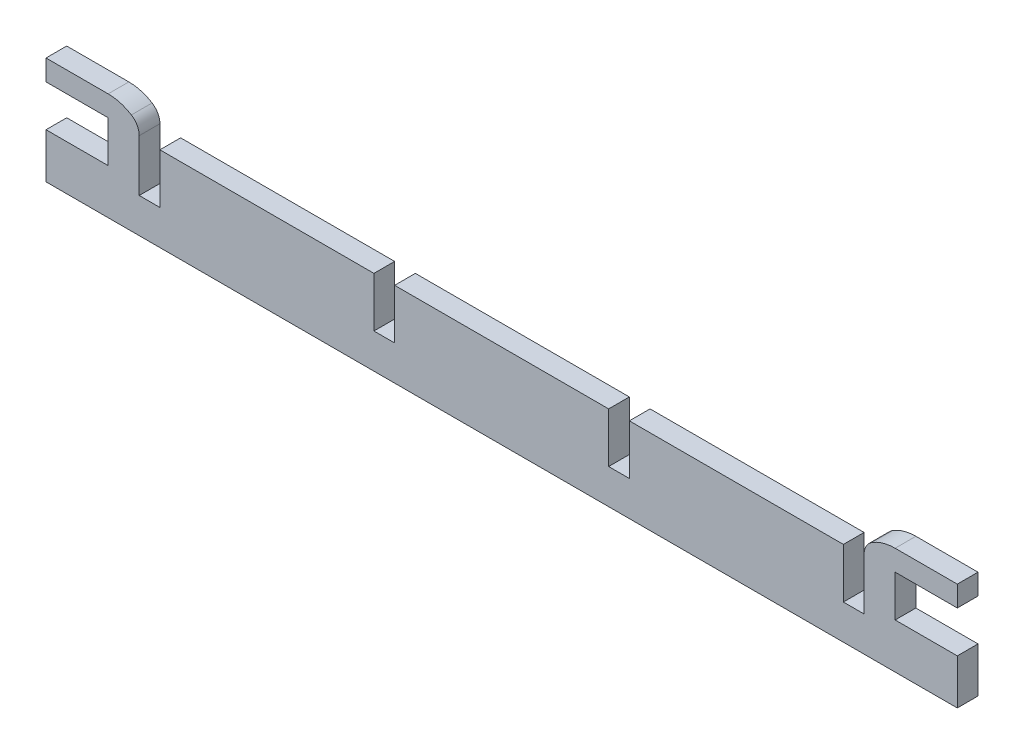
ISO-10303-21;
HEADER;
FILE_DESCRIPTION(('STEP AP214'),'2;1');
FILE_NAME('part.step','',(''),(''),'','','');
FILE_SCHEMA(('AUTOMOTIVE_DESIGN { 1 0 10303 214 1 1 1 1 }'));
ENDSEC;
DATA;
#1=APPLICATION_CONTEXT('core data for automotive mechanical design processes');
#2=APPLICATION_PROTOCOL_DEFINITION('international standard','automotive_design',2000,#1);
#3=PRODUCT_CONTEXT('',#1,'mechanical');
#4=PRODUCT('Part','Part','',(#3));
#5=PRODUCT_RELATED_PRODUCT_CATEGORY('part','',(#4));
#6=PRODUCT_DEFINITION_FORMATION('','',#4);
#7=PRODUCT_DEFINITION_CONTEXT('part definition',#1,'design');
#8=PRODUCT_DEFINITION('design','',#6,#7);
#9=PRODUCT_DEFINITION_SHAPE('','',#8);
#10=(LENGTH_UNIT() NAMED_UNIT(*) SI_UNIT(.MILLI.,.METRE.));
#11=(NAMED_UNIT(*) PLANE_ANGLE_UNIT() SI_UNIT($,.RADIAN.));
#12=(NAMED_UNIT(*) SI_UNIT($,.STERADIAN.) SOLID_ANGLE_UNIT());
#13=UNCERTAINTY_MEASURE_WITH_UNIT(LENGTH_MEASURE(1.E-05),#10,'distance_accuracy_value','');
#14=(GEOMETRIC_REPRESENTATION_CONTEXT(3) GLOBAL_UNCERTAINTY_ASSIGNED_CONTEXT((#13)) GLOBAL_UNIT_ASSIGNED_CONTEXT((#10,
#11,#12)) REPRESENTATION_CONTEXT('',''));
#15=CARTESIAN_POINT('',(0.,0.,0.));
#16=DIRECTION('',(0.,0.,1.));
#17=DIRECTION('',(1.,0.,0.));
#18=AXIS2_PLACEMENT_3D('',#15,#16,#17);
#19=CARTESIAN_POINT('',(34.925,12.1310866467926,6.35));
#20=DIRECTION('',(0.,-1.,0.));
#21=DIRECTION('',(1.,0.,0.));
#22=AXIS2_PLACEMENT_3D('',#19,#20,#21);
#23=PLANE('',#22);
#24=DIRECTION('',(-1.,0.,0.));
#25=VECTOR('',#24,1.);
#26=CARTESIAN_POINT('',(34.925,12.1310866467926,6.35));
#27=LINE('',#26,#25);
#28=CARTESIAN_POINT('',(100.541666666667,12.1310866467926,6.35));
#29=VERTEX_POINT('',#28);
#30=CARTESIAN_POINT('',(34.925,12.1310866467926,6.35));
#31=VERTEX_POINT('',#30);
#32=EDGE_CURVE('E463',#29,#31,#27,.T.);
#33=ORIENTED_EDGE('',*,*,#32,.F.);
#34=DIRECTION('',(0.,0.,1.));
#35=VECTOR('',#34,1.);
#36=CARTESIAN_POINT('',(100.541666666667,12.1310866467926,0.));
#37=LINE('',#36,#35);
#38=CARTESIAN_POINT('',(100.541666666667,12.1310866467926,0.));
#39=VERTEX_POINT('',#38);
#40=EDGE_CURVE('E286',#39,#29,#37,.T.);
#41=ORIENTED_EDGE('',*,*,#40,.F.);
#42=DIRECTION('',(-1.,0.,0.));
#43=VECTOR('',#42,1.);
#44=CARTESIAN_POINT('',(34.925,12.1310866467926,0.));
#45=LINE('',#44,#43);
#46=CARTESIAN_POINT('',(34.925,12.1310866467926,0.));
#47=VERTEX_POINT('',#46);
#48=EDGE_CURVE('E271',#39,#47,#45,.T.);
#49=ORIENTED_EDGE('',*,*,#48,.T.);
#50=DIRECTION('',(0.,0.,-1.));
#51=VECTOR('',#50,1.);
#52=CARTESIAN_POINT('',(34.925,12.1310866467926,6.35));
#53=LINE('',#52,#51);
#54=EDGE_CURVE('E48',#31,#47,#53,.T.);
#55=ORIENTED_EDGE('',*,*,#54,.F.);
#56=EDGE_LOOP('',(#33,#41,#49,#55));
#57=FACE_BOUND('',#56,.T.);
#58=ADVANCED_FACE('F39',(#57),#23,.F.);
#59=CARTESIAN_POINT('',(172.508333333333,12.1310866467926,0.));
#60=VERTEX_POINT('',#59);
#61=CARTESIAN_POINT('',(106.891666666667,12.1310866467926,0.));
#62=VERTEX_POINT('',#61);
#63=EDGE_CURVE('E511',#60,#62,#45,.T.);
#64=ORIENTED_EDGE('',*,*,#63,.T.);
#65=DIRECTION('',(0.,0.,1.));
#66=VECTOR('',#65,1.);
#67=CARTESIAN_POINT('',(106.891666666667,12.1310866467926,0.));
#68=LINE('',#67,#66);
#69=CARTESIAN_POINT('',(106.891666666667,12.1310866467926,6.35));
#70=VERTEX_POINT('',#69);
#71=EDGE_CURVE('E290',#62,#70,#68,.T.);
#72=ORIENTED_EDGE('',*,*,#71,.T.);
#73=CARTESIAN_POINT('',(172.508333333333,12.1310866467926,6.35));
#74=VERTEX_POINT('',#73);
#75=EDGE_CURVE('E469',#74,#70,#27,.T.);
#76=ORIENTED_EDGE('',*,*,#75,.F.);
#77=DIRECTION('',(0.,0.,1.));
#78=VECTOR('',#77,1.);
#79=CARTESIAN_POINT('',(172.508333333333,12.1310866467926,0.));
#80=LINE('',#79,#78);
#81=EDGE_CURVE('E283',#60,#74,#80,.T.);
#82=ORIENTED_EDGE('',*,*,#81,.F.);
#83=EDGE_LOOP('',(#64,#72,#76,#82));
#84=FACE_BOUND('',#83,.T.);
#85=ADVANCED_FACE('F612',(#84),#23,.F.);
#86=CARTESIAN_POINT('',(0.,0.,6.35));
#87=DIRECTION('',(1.,0.,0.));
#88=DIRECTION('',(0.,1.,0.));
#89=AXIS2_PLACEMENT_3D('',#86,#87,#88);
#90=PLANE('',#89);
#91=DIRECTION('',(0.,-1.,0.));
#92=VECTOR('',#91,1.);
#93=CARTESIAN_POINT('',(0.,0.,0.));
#94=LINE('',#93,#92);
#95=CARTESIAN_POINT('',(0.,0.,0.));
#96=VERTEX_POINT('',#95);
#97=CARTESIAN_POINT('',(0.,-13.843,0.));
#98=VERTEX_POINT('',#97);
#99=EDGE_CURVE('E454',#96,#98,#94,.T.);
#100=ORIENTED_EDGE('',*,*,#99,.T.);
#101=DIRECTION('',(0.,0.,-1.));
#102=VECTOR('',#101,1.);
#103=CARTESIAN_POINT('',(0.,-13.843,6.35));
#104=LINE('',#103,#102);
#105=CARTESIAN_POINT('',(0.,-13.843,6.35));
#106=VERTEX_POINT('',#105);
#107=EDGE_CURVE('E11',#106,#98,#104,.T.);
#108=ORIENTED_EDGE('',*,*,#107,.F.);
#109=DIRECTION('',(0.,-1.,0.));
#110=VECTOR('',#109,1.);
#111=CARTESIAN_POINT('',(0.,0.,6.35));
#112=LINE('',#111,#110);
#113=CARTESIAN_POINT('',(0.,0.,6.35));
#114=VERTEX_POINT('',#113);
#115=EDGE_CURVE('E455',#114,#106,#112,.T.);
#116=ORIENTED_EDGE('',*,*,#115,.F.);
#117=DIRECTION('',(0.,0.,-1.));
#118=VECTOR('',#117,1.);
#119=CARTESIAN_POINT('',(0.,0.,6.35));
#120=LINE('',#119,#118);
#121=EDGE_CURVE('E499',#114,#96,#120,.T.);
#122=ORIENTED_EDGE('',*,*,#121,.T.);
#123=EDGE_LOOP('',(#100,#108,#116,#122));
#124=FACE_BOUND('',#123,.T.);
#125=ADVANCED_FACE('F41',(#124),#90,.F.);
#126=CARTESIAN_POINT('',(0.,-13.843,6.35));
#127=DIRECTION('',(0.,1.,0.));
#128=DIRECTION('',(0.,0.,1.));
#129=AXIS2_PLACEMENT_3D('',#126,#127,#128);
#130=PLANE('',#129);
#131=DIRECTION('',(1.,0.,0.));
#132=VECTOR('',#131,1.);
#133=CARTESIAN_POINT('',(0.,-13.843,0.));
#134=LINE('',#133,#132);
#135=CARTESIAN_POINT('',(279.4,-13.843,0.));
#136=VERTEX_POINT('',#135);
#137=EDGE_CURVE('E503',#98,#136,#134,.T.);
#138=ORIENTED_EDGE('',*,*,#137,.T.);
#139=DIRECTION('',(0.,0.,-1.));
#140=VECTOR('',#139,1.);
#141=CARTESIAN_POINT('',(279.4,-13.843,6.35));
#142=LINE('',#141,#140);
#143=CARTESIAN_POINT('',(279.4,-13.843,6.35));
#144=VERTEX_POINT('',#143);
#145=EDGE_CURVE('E374',#144,#136,#142,.T.);
#146=ORIENTED_EDGE('',*,*,#145,.F.);
#147=DIRECTION('',(1.,0.,0.));
#148=VECTOR('',#147,1.);
#149=CARTESIAN_POINT('',(0.,-13.843,6.35));
#150=LINE('',#149,#148);
#151=EDGE_CURVE('E459',#106,#144,#150,.T.);
#152=ORIENTED_EDGE('',*,*,#151,.F.);
#153=ORIENTED_EDGE('',*,*,#107,.T.);
#154=EDGE_LOOP('',(#138,#146,#152,#153));
#155=FACE_BOUND('',#154,.T.);
#156=ADVANCED_FACE('F625',(#155),#130,.F.);
#157=CARTESIAN_POINT('',(244.475,12.1310866467926,0.));
#158=VERTEX_POINT('',#157);
#159=CARTESIAN_POINT('',(178.858333333333,12.1310866467926,0.));
#160=VERTEX_POINT('',#159);
#161=EDGE_CURVE('E506',#158,#160,#45,.T.);
#162=ORIENTED_EDGE('',*,*,#161,.T.);
#163=DIRECTION('',(0.,0.,1.));
#164=VECTOR('',#163,1.);
#165=CARTESIAN_POINT('',(178.858333333333,12.1310866467926,0.));
#166=LINE('',#165,#164);
#167=CARTESIAN_POINT('',(178.858333333333,12.1310866467926,6.35));
#168=VERTEX_POINT('',#167);
#169=EDGE_CURVE('E320',#160,#168,#166,.T.);
#170=ORIENTED_EDGE('',*,*,#169,.T.);
#171=CARTESIAN_POINT('',(244.475,12.1310866467926,6.35));
#172=VERTEX_POINT('',#171);
#173=EDGE_CURVE('E464',#172,#168,#27,.T.);
#174=ORIENTED_EDGE('',*,*,#173,.F.);
#175=DIRECTION('',(0.,0.,-1.));
#176=VECTOR('',#175,1.);
#177=CARTESIAN_POINT('',(244.475,12.1310866467926,6.35));
#178=LINE('',#177,#176);
#179=EDGE_CURVE('E419',#172,#158,#178,.T.);
#180=ORIENTED_EDGE('',*,*,#179,.T.);
#181=EDGE_LOOP('',(#162,#170,#174,#180));
#182=FACE_BOUND('',#181,.T.);
#183=ADVANCED_FACE('F619',(#182),#23,.F.);
#184=CARTESIAN_POINT('',(34.925,-3.175,6.35));
#185=DIRECTION('',(1.,0.,0.));
#186=DIRECTION('',(0.,0.,-1.));
#187=AXIS2_PLACEMENT_3D('',#184,#185,#186);
#188=PLANE('',#187);
#189=DIRECTION('',(0.,-1.,0.));
#190=VECTOR('',#189,1.);
#191=CARTESIAN_POINT('',(34.925,-3.175,0.));
#192=LINE('',#191,#190);
#193=CARTESIAN_POINT('',(34.925,-3.175,0.));
#194=VERTEX_POINT('',#193);
#195=EDGE_CURVE('E510',#47,#194,#192,.T.);
#196=ORIENTED_EDGE('',*,*,#195,.T.);
#197=DIRECTION('',(0.,0.,-1.));
#198=VECTOR('',#197,1.);
#199=CARTESIAN_POINT('',(34.925,-3.175,6.35));
#200=LINE('',#199,#198);
#201=CARTESIAN_POINT('',(34.925,-3.175,6.35));
#202=VERTEX_POINT('',#201);
#203=EDGE_CURVE('E576',#202,#194,#200,.T.);
#204=ORIENTED_EDGE('',*,*,#203,.F.);
#205=DIRECTION('',(0.,-1.,0.));
#206=VECTOR('',#205,1.);
#207=CARTESIAN_POINT('',(34.925,-3.175,6.35));
#208=LINE('',#207,#206);
#209=EDGE_CURVE('E468',#31,#202,#208,.T.);
#210=ORIENTED_EDGE('',*,*,#209,.F.);
#211=ORIENTED_EDGE('',*,*,#54,.T.);
#212=EDGE_LOOP('',(#196,#204,#210,#211));
#213=FACE_BOUND('',#212,.T.);
#214=ADVANCED_FACE('F584',(#213),#188,.F.);
#215=CARTESIAN_POINT('',(28.575,-3.175,6.35));
#216=DIRECTION('',(0.,-1.,0.));
#217=DIRECTION('',(1.,0.,0.));
#218=AXIS2_PLACEMENT_3D('',#215,#216,#217);
#219=PLANE('',#218);
#220=DIRECTION('',(-1.,0.,0.));
#221=VECTOR('',#220,1.);
#222=CARTESIAN_POINT('',(28.575,-3.175,0.));
#223=LINE('',#222,#221);
#224=CARTESIAN_POINT('',(28.575,-3.175,0.));
#225=VERTEX_POINT('',#224);
#226=EDGE_CURVE('E514',#194,#225,#223,.T.);
#227=ORIENTED_EDGE('',*,*,#226,.T.);
#228=DIRECTION('',(0.,0.,-1.));
#229=VECTOR('',#228,1.);
#230=CARTESIAN_POINT('',(28.575,-3.175,6.35));
#231=LINE('',#230,#229);
#232=CARTESIAN_POINT('',(28.575,-3.175,6.35));
#233=VERTEX_POINT('',#232);
#234=EDGE_CURVE('E572',#233,#225,#231,.T.);
#235=ORIENTED_EDGE('',*,*,#234,.F.);
#236=DIRECTION('',(-1.,0.,0.));
#237=VECTOR('',#236,1.);
#238=CARTESIAN_POINT('',(28.575,-3.175,6.35));
#239=LINE('',#238,#237);
#240=EDGE_CURVE('E472',#202,#233,#239,.T.);
#241=ORIENTED_EDGE('',*,*,#240,.F.);
#242=ORIENTED_EDGE('',*,*,#203,.T.);
#243=EDGE_LOOP('',(#227,#235,#241,#242));
#244=FACE_BOUND('',#243,.T.);
#245=ADVANCED_FACE('F592',(#244),#219,.F.);
#246=CARTESIAN_POINT('',(28.575,0.,6.35));
#247=DIRECTION('',(-1.,0.,0.));
#248=DIRECTION('',(0.,-1.,0.));
#249=AXIS2_PLACEMENT_3D('',#246,#247,#248);
#250=PLANE('',#249);
#251=DIRECTION('',(0.,1.,0.));
#252=VECTOR('',#251,1.);
#253=CARTESIAN_POINT('',(28.575,0.,0.));
#254=LINE('',#253,#252);
#255=CARTESIAN_POINT('',(28.575,12.7,0.));
#256=VERTEX_POINT('',#255);
#257=EDGE_CURVE('E518',#225,#256,#254,.T.);
#258=ORIENTED_EDGE('',*,*,#257,.T.);
#259=DIRECTION('',(0.,0.,-1.));
#260=VECTOR('',#259,1.);
#261=CARTESIAN_POINT('',(28.575,12.7,6.35));
#262=LINE('',#261,#260);
#263=CARTESIAN_POINT('',(28.575,12.7,6.35));
#264=VERTEX_POINT('',#263);
#265=EDGE_CURVE('E568',#264,#256,#262,.T.);
#266=ORIENTED_EDGE('',*,*,#265,.F.);
#267=DIRECTION('',(0.,1.,0.));
#268=VECTOR('',#267,1.);
#269=CARTESIAN_POINT('',(28.575,0.,6.35));
#270=LINE('',#269,#268);
#271=EDGE_CURVE('E475',#233,#264,#270,.T.);
#272=ORIENTED_EDGE('',*,*,#271,.F.);
#273=ORIENTED_EDGE('',*,*,#234,.T.);
#274=EDGE_LOOP('',(#258,#266,#272,#273));
#275=FACE_BOUND('',#274,.T.);
#276=ADVANCED_FACE('F596',(#275),#250,.F.);
#277=CARTESIAN_POINT('',(23.495,12.7,6.35));
#278=DIRECTION('',(0.,0.,-1.));
#279=DIRECTION('',(-1.,0.,0.));
#280=AXIS2_PLACEMENT_3D('',#277,#278,#279);
#281=CYLINDRICAL_SURFACE('',#280,5.08);
#282=CARTESIAN_POINT('',(23.495,12.7,0.));
#283=DIRECTION('',(0.,0.,1.));
#284=DIRECTION('',(-1.,0.,0.));
#285=AXIS2_PLACEMENT_3D('',#282,#283,#284);
#286=CIRCLE('',#285,5.08);
#287=CARTESIAN_POINT('',(26.1787735849057,17.0132075471698,0.));
#288=VERTEX_POINT('',#287);
#289=EDGE_CURVE('E521',#256,#288,#286,.T.);
#290=ORIENTED_EDGE('',*,*,#289,.T.);
#291=DIRECTION('',(0.,0.,-1.));
#292=VECTOR('',#291,1.);
#293=CARTESIAN_POINT('',(26.1787735849057,17.0132075471698,6.35));
#294=LINE('',#293,#292);
#295=CARTESIAN_POINT('',(26.1787735849057,17.0132075471698,6.35));
#296=VERTEX_POINT('',#295);
#297=EDGE_CURVE('E564',#296,#288,#294,.T.);
#298=ORIENTED_EDGE('',*,*,#297,.F.);
#299=CARTESIAN_POINT('',(23.495,12.7,6.35));
#300=DIRECTION('',(0.,0.,1.));
#301=DIRECTION('',(-1.,0.,0.));
#302=AXIS2_PLACEMENT_3D('',#299,#300,#301);
#303=CIRCLE('',#302,5.08);
#304=EDGE_CURVE('E478',#264,#296,#303,.T.);
#305=ORIENTED_EDGE('',*,*,#304,.F.);
#306=ORIENTED_EDGE('',*,*,#265,.T.);
#307=EDGE_LOOP('',(#290,#298,#305,#306));
#308=FACE_BOUND('',#307,.T.);
#309=ADVANCED_FACE('F718',(#308),#281,.T.);
#310=CARTESIAN_POINT('',(19.05,5.55624999999997,6.35));
#311=DIRECTION('',(0.,0.,-1.));
#312=DIRECTION('',(-1.,0.,0.));
#313=AXIS2_PLACEMENT_3D('',#310,#311,#312);
#314=CYLINDRICAL_SURFACE('',#313,13.49375);
#315=CARTESIAN_POINT('',(19.05,5.55624999999997,0.));
#316=DIRECTION('',(0.,0.,1.));
#317=DIRECTION('',(-1.,0.,0.));
#318=AXIS2_PLACEMENT_3D('',#315,#316,#317);
#319=CIRCLE('',#318,13.49375);
#320=CARTESIAN_POINT('',(19.05,19.05,0.));
#321=VERTEX_POINT('',#320);
#322=EDGE_CURVE('E524',#288,#321,#319,.T.);
#323=ORIENTED_EDGE('',*,*,#322,.T.);
#324=DIRECTION('',(0.,0.,-1.));
#325=VECTOR('',#324,1.);
#326=CARTESIAN_POINT('',(19.05,19.05,6.35));
#327=LINE('',#326,#325);
#328=CARTESIAN_POINT('',(19.05,19.05,6.35));
#329=VERTEX_POINT('',#328);
#330=EDGE_CURVE('E560',#329,#321,#327,.T.);
#331=ORIENTED_EDGE('',*,*,#330,.F.);
#332=CARTESIAN_POINT('',(19.05,5.55624999999997,6.35));
#333=DIRECTION('',(0.,0.,1.));
#334=DIRECTION('',(-1.,0.,0.));
#335=AXIS2_PLACEMENT_3D('',#332,#333,#334);
#336=CIRCLE('',#335,13.49375);
#337=EDGE_CURVE('E481',#296,#329,#336,.T.);
#338=ORIENTED_EDGE('',*,*,#337,.F.);
#339=ORIENTED_EDGE('',*,*,#297,.T.);
#340=EDGE_LOOP('',(#323,#331,#338,#339));
#341=FACE_BOUND('',#340,.T.);
#342=ADVANCED_FACE('F716',(#341),#314,.T.);
#343=CARTESIAN_POINT('',(0.,19.05,6.35));
#344=DIRECTION('',(0.,-1.,0.));
#345=DIRECTION('',(1.,0.,0.));
#346=AXIS2_PLACEMENT_3D('',#343,#344,#345);
#347=PLANE('',#346);
#348=DIRECTION('',(-1.,0.,0.));
#349=VECTOR('',#348,1.);
#350=CARTESIAN_POINT('',(0.,19.05,0.));
#351=LINE('',#350,#349);
#352=CARTESIAN_POINT('',(0.,19.05,0.));
#353=VERTEX_POINT('',#352);
#354=EDGE_CURVE('E527',#321,#353,#351,.T.);
#355=ORIENTED_EDGE('',*,*,#354,.T.);
#356=DIRECTION('',(0.,0.,-1.));
#357=VECTOR('',#356,1.);
#358=CARTESIAN_POINT('',(0.,19.05,6.35));
#359=LINE('',#358,#357);
#360=CARTESIAN_POINT('',(0.,19.05,6.35));
#361=VERTEX_POINT('',#360);
#362=EDGE_CURVE('E556',#361,#353,#359,.T.);
#363=ORIENTED_EDGE('',*,*,#362,.F.);
#364=DIRECTION('',(-1.,0.,0.));
#365=VECTOR('',#364,1.);
#366=CARTESIAN_POINT('',(0.,19.05,6.35));
#367=LINE('',#366,#365);
#368=EDGE_CURVE('E484',#329,#361,#367,.T.);
#369=ORIENTED_EDGE('',*,*,#368,.F.);
#370=ORIENTED_EDGE('',*,*,#330,.T.);
#371=EDGE_LOOP('',(#355,#363,#369,#370));
#372=FACE_BOUND('',#371,.T.);
#373=ADVANCED_FACE('F711',(#372),#347,.F.);
#374=CARTESIAN_POINT('',(0.,12.7,6.35));
#375=DIRECTION('',(1.,0.,0.));
#376=DIRECTION('',(0.,1.,0.));
#377=AXIS2_PLACEMENT_3D('',#374,#375,#376);
#378=PLANE('',#377);
#379=DIRECTION('',(0.,-1.,0.));
#380=VECTOR('',#379,1.);
#381=CARTESIAN_POINT('',(0.,12.7,0.));
#382=LINE('',#381,#380);
#383=CARTESIAN_POINT('',(0.,12.7,0.));
#384=VERTEX_POINT('',#383);
#385=EDGE_CURVE('E530',#353,#384,#382,.T.);
#386=ORIENTED_EDGE('',*,*,#385,.T.);
#387=DIRECTION('',(0.,0.,-1.));
#388=VECTOR('',#387,1.);
#389=CARTESIAN_POINT('',(0.,12.7,6.35));
#390=LINE('',#389,#388);
#391=CARTESIAN_POINT('',(0.,12.7,6.35));
#392=VERTEX_POINT('',#391);
#393=EDGE_CURVE('E552',#392,#384,#390,.T.);
#394=ORIENTED_EDGE('',*,*,#393,.F.);
#395=DIRECTION('',(0.,-1.,0.));
#396=VECTOR('',#395,1.);
#397=CARTESIAN_POINT('',(0.,12.7,6.35));
#398=LINE('',#397,#396);
#399=EDGE_CURVE('E487',#361,#392,#398,.T.);
#400=ORIENTED_EDGE('',*,*,#399,.F.);
#401=ORIENTED_EDGE('',*,*,#362,.T.);
#402=EDGE_LOOP('',(#386,#394,#400,#401));
#403=FACE_BOUND('',#402,.T.);
#404=ADVANCED_FACE('F706',(#403),#378,.F.);
#405=CARTESIAN_POINT('',(19.05,12.7,6.35));
#406=DIRECTION('',(0.,1.,0.));
#407=DIRECTION('',(0.,0.,1.));
#408=AXIS2_PLACEMENT_3D('',#405,#406,#407);
#409=PLANE('',#408);
#410=DIRECTION('',(1.,0.,0.));
#411=VECTOR('',#410,1.);
#412=CARTESIAN_POINT('',(19.05,12.7,0.));
#413=LINE('',#412,#411);
#414=CARTESIAN_POINT('',(19.05,12.7,0.));
#415=VERTEX_POINT('',#414);
#416=EDGE_CURVE('E533',#384,#415,#413,.T.);
#417=ORIENTED_EDGE('',*,*,#416,.T.);
#418=DIRECTION('',(0.,0.,-1.));
#419=VECTOR('',#418,1.);
#420=CARTESIAN_POINT('',(19.05,12.7,6.35));
#421=LINE('',#420,#419);
#422=CARTESIAN_POINT('',(19.05,12.7,6.35));
#423=VERTEX_POINT('',#422);
#424=EDGE_CURVE('E548',#423,#415,#421,.T.);
#425=ORIENTED_EDGE('',*,*,#424,.F.);
#426=DIRECTION('',(1.,0.,0.));
#427=VECTOR('',#426,1.);
#428=CARTESIAN_POINT('',(19.05,12.7,6.35));
#429=LINE('',#428,#427);
#430=EDGE_CURVE('E490',#392,#423,#429,.T.);
#431=ORIENTED_EDGE('',*,*,#430,.F.);
#432=ORIENTED_EDGE('',*,*,#393,.T.);
#433=EDGE_LOOP('',(#417,#425,#431,#432));
#434=FACE_BOUND('',#433,.T.);
#435=ADVANCED_FACE('F702',(#434),#409,.F.);
#436=CARTESIAN_POINT('',(19.05,0.,6.35));
#437=DIRECTION('',(1.,0.,0.));
#438=DIRECTION('',(0.,0.,-1.));
#439=AXIS2_PLACEMENT_3D('',#436,#437,#438);
#440=PLANE('',#439);
#441=DIRECTION('',(0.,-1.,0.));
#442=VECTOR('',#441,1.);
#443=CARTESIAN_POINT('',(19.05,0.,0.));
#444=LINE('',#443,#442);
#445=CARTESIAN_POINT('',(19.05,0.,0.));
#446=VERTEX_POINT('',#445);
#447=EDGE_CURVE('E536',#415,#446,#444,.T.);
#448=ORIENTED_EDGE('',*,*,#447,.T.);
#449=DIRECTION('',(0.,0.,-1.));
#450=VECTOR('',#449,1.);
#451=CARTESIAN_POINT('',(19.05,0.,6.35));
#452=LINE('',#451,#450);
#453=CARTESIAN_POINT('',(19.05,0.,6.35));
#454=VERTEX_POINT('',#453);
#455=EDGE_CURVE('E544',#454,#446,#452,.T.);
#456=ORIENTED_EDGE('',*,*,#455,.F.);
#457=DIRECTION('',(0.,-1.,0.));
#458=VECTOR('',#457,1.);
#459=CARTESIAN_POINT('',(19.05,0.,6.35));
#460=LINE('',#459,#458);
#461=EDGE_CURVE('E493',#423,#454,#460,.T.);
#462=ORIENTED_EDGE('',*,*,#461,.F.);
#463=ORIENTED_EDGE('',*,*,#424,.T.);
#464=EDGE_LOOP('',(#448,#456,#462,#463));
#465=FACE_BOUND('',#464,.T.);
#466=ADVANCED_FACE('F697',(#465),#440,.F.);
#467=CARTESIAN_POINT('',(0.,0.,6.35));
#468=DIRECTION('',(0.,-1.,0.));
#469=DIRECTION('',(0.,0.,-1.));
#470=AXIS2_PLACEMENT_3D('',#467,#468,#469);
#471=PLANE('',#470);
#472=DIRECTION('',(-1.,0.,0.));
#473=VECTOR('',#472,1.);
#474=CARTESIAN_POINT('',(0.,0.,0.));
#475=LINE('',#474,#473);
#476=EDGE_CURVE('E460',#446,#96,#475,.T.);
#477=ORIENTED_EDGE('',*,*,#476,.T.);
#478=ORIENTED_EDGE('',*,*,#121,.F.);
#479=DIRECTION('',(-1.,0.,0.));
#480=VECTOR('',#479,1.);
#481=CARTESIAN_POINT('',(0.,0.,6.35));
#482=LINE('',#481,#480);
#483=EDGE_CURVE('E496',#454,#114,#482,.T.);
#484=ORIENTED_EDGE('',*,*,#483,.F.);
#485=ORIENTED_EDGE('',*,*,#455,.T.);
#486=EDGE_LOOP('',(#477,#478,#484,#485));
#487=FACE_BOUND('',#486,.T.);
#488=ADVANCED_FACE('F691',(#487),#471,.F.);
#489=CARTESIAN_POINT('',(23.495,12.7,6.35));
#490=DIRECTION('',(0.,0.,-1.));
#491=DIRECTION('',(-1.,0.,0.));
#492=AXIS2_PLACEMENT_3D('',#489,#490,#491);
#493=PLANE('',#492);
#494=DIRECTION('',(1.,0.,0.));
#495=VECTOR('',#494,1.);
#496=CARTESIAN_POINT('',(106.891666666667,-3.17500000000003,6.35));
#497=LINE('',#496,#495);
#498=CARTESIAN_POINT('',(100.541666666667,-3.17500000000003,6.35));
#499=VERTEX_POINT('',#498);
#500=CARTESIAN_POINT('',(106.891666666667,-3.17500000000003,6.35));
#501=VERTEX_POINT('',#500);
#502=EDGE_CURVE('E276',#499,#501,#497,.T.);
#503=ORIENTED_EDGE('',*,*,#502,.F.);
#504=DIRECTION('',(0.,-1.,0.));
#505=VECTOR('',#504,1.);
#506=CARTESIAN_POINT('',(100.541666666667,-3.17500000000003,6.35));
#507=LINE('',#506,#505);
#508=EDGE_CURVE('E255',#29,#499,#507,.T.);
#509=ORIENTED_EDGE('',*,*,#508,.F.);
#510=ORIENTED_EDGE('',*,*,#32,.T.);
#511=ORIENTED_EDGE('',*,*,#209,.T.);
#512=ORIENTED_EDGE('',*,*,#240,.T.);
#513=ORIENTED_EDGE('',*,*,#271,.T.);
#514=ORIENTED_EDGE('',*,*,#304,.T.);
#515=ORIENTED_EDGE('',*,*,#337,.T.);
#516=ORIENTED_EDGE('',*,*,#368,.T.);
#517=ORIENTED_EDGE('',*,*,#399,.T.);
#518=ORIENTED_EDGE('',*,*,#430,.T.);
#519=ORIENTED_EDGE('',*,*,#461,.T.);
#520=ORIENTED_EDGE('',*,*,#483,.T.);
#521=ORIENTED_EDGE('',*,*,#115,.T.);
#522=ORIENTED_EDGE('',*,*,#151,.T.);
#523=DIRECTION('',(0.,-1.,0.));
#524=VECTOR('',#523,1.);
#525=CARTESIAN_POINT('',(279.4,0.,6.35));
#526=LINE('',#525,#524);
#527=CARTESIAN_POINT('',(279.4,0.,6.35));
#528=VERTEX_POINT('',#527);
#529=EDGE_CURVE('E329',#528,#144,#526,.T.);
#530=ORIENTED_EDGE('',*,*,#529,.F.);
#531=DIRECTION('',(1.,0.,0.));
#532=VECTOR('',#531,1.);
#533=CARTESIAN_POINT('',(279.4,0.,6.35));
#534=LINE('',#533,#532);
#535=CARTESIAN_POINT('',(260.35,0.,6.35));
#536=VERTEX_POINT('',#535);
#537=EDGE_CURVE('E333',#536,#528,#534,.T.);
#538=ORIENTED_EDGE('',*,*,#537,.F.);
#539=DIRECTION('',(0.,-1.,0.));
#540=VECTOR('',#539,1.);
#541=CARTESIAN_POINT('',(260.35,0.,6.35));
#542=LINE('',#541,#540);
#543=CARTESIAN_POINT('',(260.35,12.7,6.35));
#544=VERTEX_POINT('',#543);
#545=EDGE_CURVE('E338',#544,#536,#542,.T.);
#546=ORIENTED_EDGE('',*,*,#545,.F.);
#547=DIRECTION('',(-1.,0.,0.));
#548=VECTOR('',#547,1.);
#549=CARTESIAN_POINT('',(260.35,12.7,6.35));
#550=LINE('',#549,#548);
#551=CARTESIAN_POINT('',(279.4,12.7,6.35));
#552=VERTEX_POINT('',#551);
#553=EDGE_CURVE('E342',#552,#544,#550,.T.);
#554=ORIENTED_EDGE('',*,*,#553,.F.);
#555=DIRECTION('',(0.,-1.,0.));
#556=VECTOR('',#555,1.);
#557=CARTESIAN_POINT('',(279.4,12.7,6.35));
#558=LINE('',#557,#556);
#559=CARTESIAN_POINT('',(279.4,19.05,6.35));
#560=VERTEX_POINT('',#559);
#561=EDGE_CURVE('E346',#560,#552,#558,.T.);
#562=ORIENTED_EDGE('',*,*,#561,.F.);
#563=DIRECTION('',(1.,0.,0.));
#564=VECTOR('',#563,1.);
#565=CARTESIAN_POINT('',(279.4,19.05,6.35));
#566=LINE('',#565,#564);
#567=CARTESIAN_POINT('',(260.35,19.05,6.35));
#568=VERTEX_POINT('',#567);
#569=EDGE_CURVE('E350',#568,#560,#566,.T.);
#570=ORIENTED_EDGE('',*,*,#569,.F.);
#571=CARTESIAN_POINT('',(260.35,5.55624999999997,6.35));
#572=DIRECTION('',(0.,0.,-1.));
#573=DIRECTION('',(1.,0.,0.));
#574=AXIS2_PLACEMENT_3D('',#571,#572,#573);
#575=CIRCLE('',#574,13.49375);
#576=CARTESIAN_POINT('',(253.221226415094,17.0132075471698,6.35));
#577=VERTEX_POINT('',#576);
#578=EDGE_CURVE('E354',#577,#568,#575,.T.);
#579=ORIENTED_EDGE('',*,*,#578,.F.);
#580=CARTESIAN_POINT('',(255.905,12.7,6.35));
#581=DIRECTION('',(0.,0.,-1.));
#582=DIRECTION('',(1.,0.,0.));
#583=AXIS2_PLACEMENT_3D('',#580,#581,#582);
#584=CIRCLE('',#583,5.08);
#585=CARTESIAN_POINT('',(250.825,12.7,6.35));
#586=VERTEX_POINT('',#585);
#587=EDGE_CURVE('E358',#586,#577,#584,.T.);
#588=ORIENTED_EDGE('',*,*,#587,.F.);
#589=DIRECTION('',(0.,1.,0.));
#590=VECTOR('',#589,1.);
#591=CARTESIAN_POINT('',(250.825,0.,6.35));
#592=LINE('',#591,#590);
#593=CARTESIAN_POINT('',(250.825,-3.175,6.35));
#594=VERTEX_POINT('',#593);
#595=EDGE_CURVE('E362',#594,#586,#592,.T.);
#596=ORIENTED_EDGE('',*,*,#595,.F.);
#597=DIRECTION('',(1.,0.,0.));
#598=VECTOR('',#597,1.);
#599=CARTESIAN_POINT('',(250.825,-3.175,6.35));
#600=LINE('',#599,#598);
#601=CARTESIAN_POINT('',(244.475,-3.175,6.35));
#602=VERTEX_POINT('',#601);
#603=EDGE_CURVE('E366',#602,#594,#600,.T.);
#604=ORIENTED_EDGE('',*,*,#603,.F.);
#605=DIRECTION('',(0.,-1.,0.));
#606=VECTOR('',#605,1.);
#607=CARTESIAN_POINT('',(244.475,-3.175,6.35));
#608=LINE('',#607,#606);
#609=EDGE_CURVE('E370',#172,#602,#608,.T.);
#610=ORIENTED_EDGE('',*,*,#609,.F.);
#611=ORIENTED_EDGE('',*,*,#173,.T.);
#612=DIRECTION('',(0.,1.,0.));
#613=VECTOR('',#612,1.);
#614=CARTESIAN_POINT('',(178.858333333333,-3.17499999999999,6.35));
#615=LINE('',#614,#613);
#616=CARTESIAN_POINT('',(178.858333333333,-3.17499999999999,6.35));
#617=VERTEX_POINT('',#616);
#618=EDGE_CURVE('E301',#617,#168,#615,.T.);
#619=ORIENTED_EDGE('',*,*,#618,.F.);
#620=DIRECTION('',(1.,0.,0.));
#621=VECTOR('',#620,1.);
#622=CARTESIAN_POINT('',(178.858333333333,-3.17499999999999,6.35));
#623=LINE('',#622,#621);
#624=CARTESIAN_POINT('',(172.508333333333,-3.175,6.35));
#625=VERTEX_POINT('',#624);
#626=EDGE_CURVE('E312',#625,#617,#623,.T.);
#627=ORIENTED_EDGE('',*,*,#626,.F.);
#628=DIRECTION('',(0.,-1.,0.));
#629=VECTOR('',#628,1.);
#630=CARTESIAN_POINT('',(172.508333333333,-3.175,6.35));
#631=LINE('',#630,#629);
#632=EDGE_CURVE('E308',#74,#625,#631,.T.);
#633=ORIENTED_EDGE('',*,*,#632,.F.);
#634=ORIENTED_EDGE('',*,*,#75,.T.);
#635=DIRECTION('',(0.,1.,0.));
#636=VECTOR('',#635,1.);
#637=CARTESIAN_POINT('',(106.891666666667,-3.17500000000003,6.35));
#638=LINE('',#637,#636);
#639=EDGE_CURVE('E273',#501,#70,#638,.T.);
#640=ORIENTED_EDGE('',*,*,#639,.F.);
#641=EDGE_LOOP('',(#503,#509,#510,#511,#512,#513,#514,#515,#516,#517,#518,#519,#520,#521,#522,
#530,#538,#546,#554,#562,#570,#579,#588,#596,#604,#610,#611,#619,#627,#633,#634,#640));
#642=FACE_BOUND('',#641,.T.);
#643=ADVANCED_FACE('F600',(#642),#493,.F.);
#644=CARTESIAN_POINT('',(23.495,12.7,0.));
#645=DIRECTION('',(0.,0.,-1.));
#646=DIRECTION('',(-1.,0.,0.));
#647=AXIS2_PLACEMENT_3D('',#644,#645,#646);
#648=PLANE('',#647);
#649=DIRECTION('',(0.,-1.,0.));
#650=VECTOR('',#649,1.);
#651=CARTESIAN_POINT('',(100.541666666667,-3.17500000000003,0.));
#652=LINE('',#651,#650);
#653=CARTESIAN_POINT('',(100.541666666667,-3.17500000000003,0.));
#654=VERTEX_POINT('',#653);
#655=EDGE_CURVE('E252',#39,#654,#652,.T.);
#656=ORIENTED_EDGE('',*,*,#655,.T.);
#657=DIRECTION('',(1.,0.,0.));
#658=VECTOR('',#657,1.);
#659=CARTESIAN_POINT('',(106.891666666667,-3.17500000000003,0.));
#660=LINE('',#659,#658);
#661=CARTESIAN_POINT('',(106.891666666667,-3.17500000000003,0.));
#662=VERTEX_POINT('',#661);
#663=EDGE_CURVE('E263',#654,#662,#660,.T.);
#664=ORIENTED_EDGE('',*,*,#663,.T.);
#665=DIRECTION('',(0.,1.,0.));
#666=VECTOR('',#665,1.);
#667=CARTESIAN_POINT('',(106.891666666667,-3.17500000000003,0.));
#668=LINE('',#667,#666);
#669=EDGE_CURVE('E55',#662,#62,#668,.T.);
#670=ORIENTED_EDGE('',*,*,#669,.T.);
#671=ORIENTED_EDGE('',*,*,#63,.F.);
#672=DIRECTION('',(0.,-1.,0.));
#673=VECTOR('',#672,1.);
#674=CARTESIAN_POINT('',(172.508333333333,-3.175,0.));
#675=LINE('',#674,#673);
#676=CARTESIAN_POINT('',(172.508333333333,-3.175,0.));
#677=VERTEX_POINT('',#676);
#678=EDGE_CURVE('E296',#60,#677,#675,.T.);
#679=ORIENTED_EDGE('',*,*,#678,.T.);
#680=DIRECTION('',(1.,0.,0.));
#681=VECTOR('',#680,1.);
#682=CARTESIAN_POINT('',(178.858333333333,-3.17499999999999,0.));
#683=LINE('',#682,#681);
#684=CARTESIAN_POINT('',(178.858333333333,-3.17499999999999,0.));
#685=VERTEX_POINT('',#684);
#686=EDGE_CURVE('E300',#677,#685,#683,.T.);
#687=ORIENTED_EDGE('',*,*,#686,.T.);
#688=DIRECTION('',(0.,1.,0.));
#689=VECTOR('',#688,1.);
#690=CARTESIAN_POINT('',(178.858333333333,-3.17499999999999,0.));
#691=LINE('',#690,#689);
#692=EDGE_CURVE('E63',#685,#160,#691,.T.);
#693=ORIENTED_EDGE('',*,*,#692,.T.);
#694=ORIENTED_EDGE('',*,*,#161,.F.);
#695=DIRECTION('',(0.,-1.,0.));
#696=VECTOR('',#695,1.);
#697=CARTESIAN_POINT('',(244.475,-3.175,0.));
#698=LINE('',#697,#696);
#699=CARTESIAN_POINT('',(244.475,-3.175,0.));
#700=VERTEX_POINT('',#699);
#701=EDGE_CURVE('E334',#158,#700,#698,.T.);
#702=ORIENTED_EDGE('',*,*,#701,.T.);
#703=DIRECTION('',(1.,0.,0.));
#704=VECTOR('',#703,1.);
#705=CARTESIAN_POINT('',(250.825,-3.175,0.));
#706=LINE('',#705,#704);
#707=CARTESIAN_POINT('',(250.825,-3.175,0.));
#708=VERTEX_POINT('',#707);
#709=EDGE_CURVE('E409',#700,#708,#706,.T.);
#710=ORIENTED_EDGE('',*,*,#709,.T.);
#711=DIRECTION('',(0.,1.,0.));
#712=VECTOR('',#711,1.);
#713=CARTESIAN_POINT('',(250.825,0.,0.));
#714=LINE('',#713,#712);
#715=CARTESIAN_POINT('',(250.825,12.7,0.));
#716=VERTEX_POINT('',#715);
#717=EDGE_CURVE('E406',#708,#716,#714,.T.);
#718=ORIENTED_EDGE('',*,*,#717,.T.);
#719=CARTESIAN_POINT('',(255.905,12.7,0.));
#720=DIRECTION('',(0.,0.,-1.));
#721=DIRECTION('',(1.,0.,0.));
#722=AXIS2_PLACEMENT_3D('',#719,#720,#721);
#723=CIRCLE('',#722,5.08);
#724=CARTESIAN_POINT('',(253.221226415094,17.0132075471698,0.));
#725=VERTEX_POINT('',#724);
#726=EDGE_CURVE('E402',#716,#725,#723,.T.);
#727=ORIENTED_EDGE('',*,*,#726,.T.);
#728=CARTESIAN_POINT('',(260.35,5.55624999999997,0.));
#729=DIRECTION('',(0.,0.,-1.));
#730=DIRECTION('',(1.,0.,0.));
#731=AXIS2_PLACEMENT_3D('',#728,#729,#730);
#732=CIRCLE('',#731,13.49375);
#733=CARTESIAN_POINT('',(260.35,19.05,0.));
#734=VERTEX_POINT('',#733);
#735=EDGE_CURVE('E398',#725,#734,#732,.T.);
#736=ORIENTED_EDGE('',*,*,#735,.T.);
#737=DIRECTION('',(1.,0.,0.));
#738=VECTOR('',#737,1.);
#739=CARTESIAN_POINT('',(279.4,19.05,0.));
#740=LINE('',#739,#738);
#741=CARTESIAN_POINT('',(279.4,19.05,0.));
#742=VERTEX_POINT('',#741);
#743=EDGE_CURVE('E394',#734,#742,#740,.T.);
#744=ORIENTED_EDGE('',*,*,#743,.T.);
#745=DIRECTION('',(0.,-1.,0.));
#746=VECTOR('',#745,1.);
#747=CARTESIAN_POINT('',(279.4,12.7,0.));
#748=LINE('',#747,#746);
#749=CARTESIAN_POINT('',(279.4,12.7,0.));
#750=VERTEX_POINT('',#749);
#751=EDGE_CURVE('E390',#742,#750,#748,.T.);
#752=ORIENTED_EDGE('',*,*,#751,.T.);
#753=DIRECTION('',(-1.,0.,0.));
#754=VECTOR('',#753,1.);
#755=CARTESIAN_POINT('',(260.35,12.7,0.));
#756=LINE('',#755,#754);
#757=CARTESIAN_POINT('',(260.35,12.7,0.));
#758=VERTEX_POINT('',#757);
#759=EDGE_CURVE('E386',#750,#758,#756,.T.);
#760=ORIENTED_EDGE('',*,*,#759,.T.);
#761=DIRECTION('',(0.,-1.,0.));
#762=VECTOR('',#761,1.);
#763=CARTESIAN_POINT('',(260.35,0.,0.));
#764=LINE('',#763,#762);
#765=CARTESIAN_POINT('',(260.35,0.,0.));
#766=VERTEX_POINT('',#765);
#767=EDGE_CURVE('E382',#758,#766,#764,.T.);
#768=ORIENTED_EDGE('',*,*,#767,.T.);
#769=DIRECTION('',(1.,0.,0.));
#770=VECTOR('',#769,1.);
#771=CARTESIAN_POINT('',(279.4,0.,0.));
#772=LINE('',#771,#770);
#773=CARTESIAN_POINT('',(279.4,0.,0.));
#774=VERTEX_POINT('',#773);
#775=EDGE_CURVE('E378',#766,#774,#772,.T.);
#776=ORIENTED_EDGE('',*,*,#775,.T.);
#777=DIRECTION('',(0.,-1.,0.));
#778=VECTOR('',#777,1.);
#779=CARTESIAN_POINT('',(279.4,0.,0.));
#780=LINE('',#779,#778);
#781=EDGE_CURVE('E289',#774,#136,#780,.T.);
#782=ORIENTED_EDGE('',*,*,#781,.T.);
#783=ORIENTED_EDGE('',*,*,#137,.F.);
#784=ORIENTED_EDGE('',*,*,#99,.F.);
#785=ORIENTED_EDGE('',*,*,#476,.F.);
#786=ORIENTED_EDGE('',*,*,#447,.F.);
#787=ORIENTED_EDGE('',*,*,#416,.F.);
#788=ORIENTED_EDGE('',*,*,#385,.F.);
#789=ORIENTED_EDGE('',*,*,#354,.F.);
#790=ORIENTED_EDGE('',*,*,#322,.F.);
#791=ORIENTED_EDGE('',*,*,#289,.F.);
#792=ORIENTED_EDGE('',*,*,#257,.F.);
#793=ORIENTED_EDGE('',*,*,#226,.F.);
#794=ORIENTED_EDGE('',*,*,#195,.F.);
#795=ORIENTED_EDGE('',*,*,#48,.F.);
#796=EDGE_LOOP('',(#656,#664,#670,#671,#679,#687,#693,#694,#702,#710,#718,#727,#736,#744,#752,
#760,#768,#776,#782,#783,#784,#785,#786,#787,#788,#789,#790,#791,#792,#793,#794,#795));
#797=FACE_BOUND('',#796,.T.);
#798=ADVANCED_FACE('F269',(#797),#648,.T.);
#799=CARTESIAN_POINT('',(279.4,0.,6.35));
#800=DIRECTION('',(1.,0.,0.));
#801=DIRECTION('',(0.,1.,0.));
#802=AXIS2_PLACEMENT_3D('',#799,#800,#801);
#803=PLANE('',#802);
#804=ORIENTED_EDGE('',*,*,#781,.F.);
#805=DIRECTION('',(0.,0.,-1.));
#806=VECTOR('',#805,1.);
#807=CARTESIAN_POINT('',(279.4,0.,6.35));
#808=LINE('',#807,#806);
#809=EDGE_CURVE('E451',#528,#774,#808,.T.);
#810=ORIENTED_EDGE('',*,*,#809,.F.);
#811=ORIENTED_EDGE('',*,*,#529,.T.);
#812=ORIENTED_EDGE('',*,*,#145,.T.);
#813=EDGE_LOOP('',(#804,#810,#811,#812));
#814=FACE_BOUND('',#813,.T.);
#815=ADVANCED_FACE('F681',(#814),#803,.T.);
#816=CARTESIAN_POINT('',(279.4,0.,6.35));
#817=DIRECTION('',(0.,1.,0.));
#818=DIRECTION('',(0.,0.,1.));
#819=AXIS2_PLACEMENT_3D('',#816,#817,#818);
#820=PLANE('',#819);
#821=ORIENTED_EDGE('',*,*,#775,.F.);
#822=DIRECTION('',(0.,0.,-1.));
#823=VECTOR('',#822,1.);
#824=CARTESIAN_POINT('',(260.35,0.,6.35));
#825=LINE('',#824,#823);
#826=EDGE_CURVE('E448',#536,#766,#825,.T.);
#827=ORIENTED_EDGE('',*,*,#826,.F.);
#828=ORIENTED_EDGE('',*,*,#537,.T.);
#829=ORIENTED_EDGE('',*,*,#809,.T.);
#830=EDGE_LOOP('',(#821,#827,#828,#829));
#831=FACE_BOUND('',#830,.T.);
#832=ADVANCED_FACE('F677',(#831),#820,.T.);
#833=CARTESIAN_POINT('',(260.35,0.,6.35));
#834=DIRECTION('',(1.,0.,0.));
#835=DIRECTION('',(0.,0.,-1.));
#836=AXIS2_PLACEMENT_3D('',#833,#834,#835);
#837=PLANE('',#836);
#838=ORIENTED_EDGE('',*,*,#767,.F.);
#839=DIRECTION('',(0.,0.,-1.));
#840=VECTOR('',#839,1.);
#841=CARTESIAN_POINT('',(260.35,12.7,6.35));
#842=LINE('',#841,#840);
#843=EDGE_CURVE('E445',#544,#758,#842,.T.);
#844=ORIENTED_EDGE('',*,*,#843,.F.);
#845=ORIENTED_EDGE('',*,*,#545,.T.);
#846=ORIENTED_EDGE('',*,*,#826,.T.);
#847=EDGE_LOOP('',(#838,#844,#845,#846));
#848=FACE_BOUND('',#847,.T.);
#849=ADVANCED_FACE('F673',(#848),#837,.T.);
#850=CARTESIAN_POINT('',(260.35,12.7,6.35));
#851=DIRECTION('',(0.,-1.,0.));
#852=DIRECTION('',(0.,0.,-1.));
#853=AXIS2_PLACEMENT_3D('',#850,#851,#852);
#854=PLANE('',#853);
#855=ORIENTED_EDGE('',*,*,#759,.F.);
#856=DIRECTION('',(0.,0.,-1.));
#857=VECTOR('',#856,1.);
#858=CARTESIAN_POINT('',(279.4,12.7,6.35));
#859=LINE('',#858,#857);
#860=EDGE_CURVE('E442',#552,#750,#859,.T.);
#861=ORIENTED_EDGE('',*,*,#860,.F.);
#862=ORIENTED_EDGE('',*,*,#553,.T.);
#863=ORIENTED_EDGE('',*,*,#843,.T.);
#864=EDGE_LOOP('',(#855,#861,#862,#863));
#865=FACE_BOUND('',#864,.T.);
#866=ADVANCED_FACE('F669',(#865),#854,.T.);
#867=CARTESIAN_POINT('',(279.4,12.7,6.35));
#868=DIRECTION('',(1.,0.,0.));
#869=DIRECTION('',(0.,1.,0.));
#870=AXIS2_PLACEMENT_3D('',#867,#868,#869);
#871=PLANE('',#870);
#872=ORIENTED_EDGE('',*,*,#751,.F.);
#873=DIRECTION('',(0.,0.,-1.));
#874=VECTOR('',#873,1.);
#875=CARTESIAN_POINT('',(279.4,19.05,6.35));
#876=LINE('',#875,#874);
#877=EDGE_CURVE('E439',#560,#742,#876,.T.);
#878=ORIENTED_EDGE('',*,*,#877,.F.);
#879=ORIENTED_EDGE('',*,*,#561,.T.);
#880=ORIENTED_EDGE('',*,*,#860,.T.);
#881=EDGE_LOOP('',(#872,#878,#879,#880));
#882=FACE_BOUND('',#881,.T.);
#883=ADVANCED_FACE('F665',(#882),#871,.T.);
#884=CARTESIAN_POINT('',(279.4,19.05,6.35));
#885=DIRECTION('',(0.,1.,0.));
#886=DIRECTION('',(-1.,0.,0.));
#887=AXIS2_PLACEMENT_3D('',#884,#885,#886);
#888=PLANE('',#887);
#889=ORIENTED_EDGE('',*,*,#743,.F.);
#890=DIRECTION('',(0.,0.,-1.));
#891=VECTOR('',#890,1.);
#892=CARTESIAN_POINT('',(260.35,19.05,6.35));
#893=LINE('',#892,#891);
#894=EDGE_CURVE('E436',#568,#734,#893,.T.);
#895=ORIENTED_EDGE('',*,*,#894,.F.);
#896=ORIENTED_EDGE('',*,*,#569,.T.);
#897=ORIENTED_EDGE('',*,*,#877,.T.);
#898=EDGE_LOOP('',(#889,#895,#896,#897));
#899=FACE_BOUND('',#898,.T.);
#900=ADVANCED_FACE('F661',(#899),#888,.T.);
#901=CARTESIAN_POINT('',(260.35,5.55624999999997,6.35));
#902=DIRECTION('',(0.,0.,-1.));
#903=DIRECTION('',(-1.,0.,0.));
#904=AXIS2_PLACEMENT_3D('',#901,#902,#903);
#905=CYLINDRICAL_SURFACE('',#904,13.49375);
#906=ORIENTED_EDGE('',*,*,#735,.F.);
#907=DIRECTION('',(0.,0.,-1.));
#908=VECTOR('',#907,1.);
#909=CARTESIAN_POINT('',(253.221226415094,17.0132075471698,6.35));
#910=LINE('',#909,#908);
#911=EDGE_CURVE('E433',#577,#725,#910,.T.);
#912=ORIENTED_EDGE('',*,*,#911,.F.);
#913=ORIENTED_EDGE('',*,*,#578,.T.);
#914=ORIENTED_EDGE('',*,*,#894,.T.);
#915=EDGE_LOOP('',(#906,#912,#913,#914));
#916=FACE_BOUND('',#915,.T.);
#917=ADVANCED_FACE('F657',(#916),#905,.T.);
#918=CARTESIAN_POINT('',(255.905,12.7,6.35));
#919=DIRECTION('',(0.,0.,-1.));
#920=DIRECTION('',(-1.,0.,0.));
#921=AXIS2_PLACEMENT_3D('',#918,#919,#920);
#922=CYLINDRICAL_SURFACE('',#921,5.08);
#923=ORIENTED_EDGE('',*,*,#726,.F.);
#924=DIRECTION('',(0.,0.,-1.));
#925=VECTOR('',#924,1.);
#926=CARTESIAN_POINT('',(250.825,12.7,6.35));
#927=LINE('',#926,#925);
#928=EDGE_CURVE('E429',#586,#716,#927,.T.);
#929=ORIENTED_EDGE('',*,*,#928,.F.);
#930=ORIENTED_EDGE('',*,*,#587,.T.);
#931=ORIENTED_EDGE('',*,*,#911,.T.);
#932=EDGE_LOOP('',(#923,#929,#930,#931));
#933=FACE_BOUND('',#932,.T.);
#934=ADVANCED_FACE('F653',(#933),#922,.T.);
#935=CARTESIAN_POINT('',(250.825,0.,6.35));
#936=DIRECTION('',(-1.,0.,0.));
#937=DIRECTION('',(0.,0.,1.));
#938=AXIS2_PLACEMENT_3D('',#935,#936,#937);
#939=PLANE('',#938);
#940=ORIENTED_EDGE('',*,*,#717,.F.);
#941=DIRECTION('',(0.,0.,-1.));
#942=VECTOR('',#941,1.);
#943=CARTESIAN_POINT('',(250.825,-3.175,6.35));
#944=LINE('',#943,#942);
#945=EDGE_CURVE('E426',#594,#708,#944,.T.);
#946=ORIENTED_EDGE('',*,*,#945,.F.);
#947=ORIENTED_EDGE('',*,*,#595,.T.);
#948=ORIENTED_EDGE('',*,*,#928,.T.);
#949=EDGE_LOOP('',(#940,#946,#947,#948));
#950=FACE_BOUND('',#949,.T.);
#951=ADVANCED_FACE('F650',(#950),#939,.T.);
#952=CARTESIAN_POINT('',(250.825,-3.175,6.35));
#953=DIRECTION('',(0.,1.,0.));
#954=DIRECTION('',(-1.,0.,0.));
#955=AXIS2_PLACEMENT_3D('',#952,#953,#954);
#956=PLANE('',#955);
#957=ORIENTED_EDGE('',*,*,#709,.F.);
#958=DIRECTION('',(0.,0.,-1.));
#959=VECTOR('',#958,1.);
#960=CARTESIAN_POINT('',(244.475,-3.175,6.35));
#961=LINE('',#960,#959);
#962=EDGE_CURVE('E423',#602,#700,#961,.T.);
#963=ORIENTED_EDGE('',*,*,#962,.F.);
#964=ORIENTED_EDGE('',*,*,#603,.T.);
#965=ORIENTED_EDGE('',*,*,#945,.T.);
#966=EDGE_LOOP('',(#957,#963,#964,#965));
#967=FACE_BOUND('',#966,.T.);
#968=ADVANCED_FACE('F645',(#967),#956,.T.);
#969=CARTESIAN_POINT('',(244.475,-3.175,6.35));
#970=DIRECTION('',(1.,0.,0.));
#971=DIRECTION('',(0.,0.,-1.));
#972=AXIS2_PLACEMENT_3D('',#969,#970,#971);
#973=PLANE('',#972);
#974=ORIENTED_EDGE('',*,*,#701,.F.);
#975=ORIENTED_EDGE('',*,*,#179,.F.);
#976=ORIENTED_EDGE('',*,*,#609,.T.);
#977=ORIENTED_EDGE('',*,*,#962,.T.);
#978=EDGE_LOOP('',(#974,#975,#976,#977));
#979=FACE_BOUND('',#978,.T.);
#980=ADVANCED_FACE('F642',(#979),#973,.T.);
#981=CARTESIAN_POINT('',(172.508333333333,-3.175,0.));
#982=DIRECTION('',(-1.,0.,0.));
#983=DIRECTION('',(0.,0.,1.));
#984=AXIS2_PLACEMENT_3D('',#981,#982,#983);
#985=PLANE('',#984);
#986=ORIENTED_EDGE('',*,*,#632,.T.);
#987=DIRECTION('',(0.,0.,1.));
#988=VECTOR('',#987,1.);
#989=CARTESIAN_POINT('',(172.508333333333,-3.175,0.));
#990=LINE('',#989,#988);
#991=EDGE_CURVE('E307',#677,#625,#990,.T.);
#992=ORIENTED_EDGE('',*,*,#991,.F.);
#993=ORIENTED_EDGE('',*,*,#678,.F.);
#994=ORIENTED_EDGE('',*,*,#81,.T.);
#995=EDGE_LOOP('',(#986,#992,#993,#994));
#996=FACE_BOUND('',#995,.T.);
#997=ADVANCED_FACE('F891',(#996),#985,.F.);
#998=CARTESIAN_POINT('',(178.858333333333,-3.17499999999999,0.));
#999=DIRECTION('',(1.,0.,0.));
#1000=DIRECTION('',(0.,0.,-1.));
#1001=AXIS2_PLACEMENT_3D('',#998,#999,#1000);
#1002=PLANE('',#1001);
#1003=ORIENTED_EDGE('',*,*,#618,.T.);
#1004=ORIENTED_EDGE('',*,*,#169,.F.);
#1005=ORIENTED_EDGE('',*,*,#692,.F.);
#1006=DIRECTION('',(0.,0.,1.));
#1007=VECTOR('',#1006,1.);
#1008=CARTESIAN_POINT('',(178.858333333333,-3.17499999999999,0.));
#1009=LINE('',#1008,#1007);
#1010=EDGE_CURVE('E324',#685,#617,#1009,.T.);
#1011=ORIENTED_EDGE('',*,*,#1010,.T.);
#1012=EDGE_LOOP('',(#1003,#1004,#1005,#1011));
#1013=FACE_BOUND('',#1012,.T.);
#1014=ADVANCED_FACE('F638',(#1013),#1002,.F.);
#1015=CARTESIAN_POINT('',(178.858333333333,-3.17499999999999,0.));
#1016=DIRECTION('',(0.,-1.,0.));
#1017=DIRECTION('',(1.,0.,0.));
#1018=AXIS2_PLACEMENT_3D('',#1015,#1016,#1017);
#1019=PLANE('',#1018);
#1020=ORIENTED_EDGE('',*,*,#626,.T.);
#1021=ORIENTED_EDGE('',*,*,#1010,.F.);
#1022=ORIENTED_EDGE('',*,*,#686,.F.);
#1023=ORIENTED_EDGE('',*,*,#991,.T.);
#1024=EDGE_LOOP('',(#1020,#1021,#1022,#1023));
#1025=FACE_BOUND('',#1024,.T.);
#1026=ADVANCED_FACE('F636',(#1025),#1019,.F.);
#1027=CARTESIAN_POINT('',(100.541666666667,-3.17500000000003,0.));
#1028=DIRECTION('',(-1.,0.,0.));
#1029=DIRECTION('',(0.,0.,1.));
#1030=AXIS2_PLACEMENT_3D('',#1027,#1028,#1029);
#1031=PLANE('',#1030);
#1032=ORIENTED_EDGE('',*,*,#508,.T.);
#1033=DIRECTION('',(0.,0.,1.));
#1034=VECTOR('',#1033,1.);
#1035=CARTESIAN_POINT('',(100.541666666667,-3.17500000000003,0.));
#1036=LINE('',#1035,#1034);
#1037=EDGE_CURVE('E248',#654,#499,#1036,.T.);
#1038=ORIENTED_EDGE('',*,*,#1037,.F.);
#1039=ORIENTED_EDGE('',*,*,#655,.F.);
#1040=ORIENTED_EDGE('',*,*,#40,.T.);
#1041=EDGE_LOOP('',(#1032,#1038,#1039,#1040));
#1042=FACE_BOUND('',#1041,.T.);
#1043=ADVANCED_FACE('F250',(#1042),#1031,.F.);
#1044=CARTESIAN_POINT('',(106.891666666667,-3.17500000000003,0.));
#1045=DIRECTION('',(1.,0.,0.));
#1046=DIRECTION('',(0.,0.,-1.));
#1047=AXIS2_PLACEMENT_3D('',#1044,#1045,#1046);
#1048=PLANE('',#1047);
#1049=ORIENTED_EDGE('',*,*,#639,.T.);
#1050=ORIENTED_EDGE('',*,*,#71,.F.);
#1051=ORIENTED_EDGE('',*,*,#669,.F.);
#1052=DIRECTION('',(0.,0.,1.));
#1053=VECTOR('',#1052,1.);
#1054=CARTESIAN_POINT('',(106.891666666667,-3.17500000000003,0.));
#1055=LINE('',#1054,#1053);
#1056=EDGE_CURVE('E260',#662,#501,#1055,.T.);
#1057=ORIENTED_EDGE('',*,*,#1056,.T.);
#1058=EDGE_LOOP('',(#1049,#1050,#1051,#1057));
#1059=FACE_BOUND('',#1058,.T.);
#1060=ADVANCED_FACE('F614',(#1059),#1048,.F.);
#1061=CARTESIAN_POINT('',(106.891666666667,-3.17500000000003,0.));
#1062=DIRECTION('',(0.,-1.,0.));
#1063=DIRECTION('',(1.,0.,0.));
#1064=AXIS2_PLACEMENT_3D('',#1061,#1062,#1063);
#1065=PLANE('',#1064);
#1066=ORIENTED_EDGE('',*,*,#502,.T.);
#1067=ORIENTED_EDGE('',*,*,#1056,.F.);
#1068=ORIENTED_EDGE('',*,*,#663,.F.);
#1069=ORIENTED_EDGE('',*,*,#1037,.T.);
#1070=EDGE_LOOP('',(#1066,#1067,#1068,#1069));
#1071=FACE_BOUND('',#1070,.T.);
#1072=ADVANCED_FACE('F264',(#1071),#1065,.F.);
#1073=CLOSED_SHELL('',(#58,#85,#125,#156,#183,#214,#245,#276,#309,#342,#373,#404,#435,#466,#488,
#643,#798,#815,#832,#849,#866,#883,#900,#917,#934,#951,#968,#980,#997,#1014,#1026,#1043,#1060,#1072));
#1074=MANIFOLD_SOLID_BREP('B2',#1073);
#1075=ADVANCED_BREP_SHAPE_REPRESENTATION('',(#18,#1074),#14);
#1076=SHAPE_DEFINITION_REPRESENTATION(#9,#1075);
ENDSEC;
END-ISO-10303-21;
